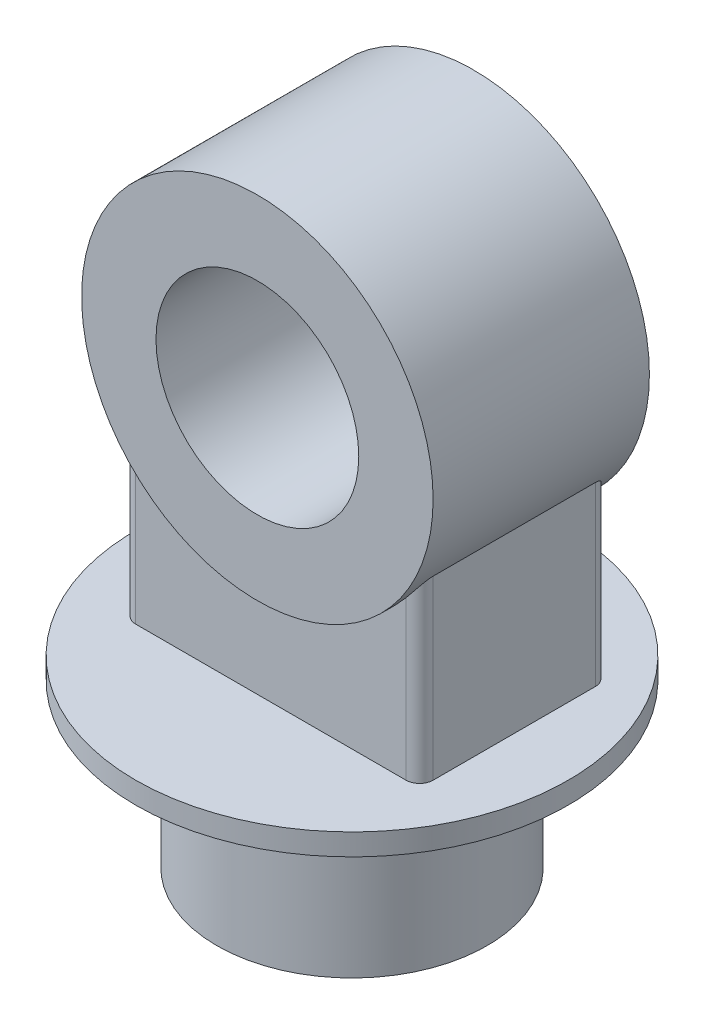
ISO-10303-21;
HEADER;
FILE_DESCRIPTION(('STEP AP214'),'2;1');
FILE_NAME('part.step','',(''),(''),'','','');
FILE_SCHEMA(('AUTOMOTIVE_DESIGN { 1 0 10303 214 1 1 1 1 }'));
ENDSEC;
DATA;
#1=APPLICATION_CONTEXT('core data for automotive mechanical design processes');
#2=APPLICATION_PROTOCOL_DEFINITION('international standard','automotive_design',2000,#1);
#3=PRODUCT_CONTEXT('',#1,'mechanical');
#4=PRODUCT('Part','Part','',(#3));
#5=PRODUCT_RELATED_PRODUCT_CATEGORY('part','',(#4));
#6=PRODUCT_DEFINITION_FORMATION('','',#4);
#7=PRODUCT_DEFINITION_CONTEXT('part definition',#1,'design');
#8=PRODUCT_DEFINITION('design','',#6,#7);
#9=PRODUCT_DEFINITION_SHAPE('','',#8);
#10=(LENGTH_UNIT() NAMED_UNIT(*) SI_UNIT(.MILLI.,.METRE.));
#11=(NAMED_UNIT(*) PLANE_ANGLE_UNIT() SI_UNIT($,.RADIAN.));
#12=(NAMED_UNIT(*) SI_UNIT($,.STERADIAN.) SOLID_ANGLE_UNIT());
#13=UNCERTAINTY_MEASURE_WITH_UNIT(LENGTH_MEASURE(1.E-05),#10,'distance_accuracy_value','');
#14=(GEOMETRIC_REPRESENTATION_CONTEXT(3) GLOBAL_UNCERTAINTY_ASSIGNED_CONTEXT((#13)) GLOBAL_UNIT_ASSIGNED_CONTEXT((#10,
#11,#12)) REPRESENTATION_CONTEXT('',''));
#15=CARTESIAN_POINT('',(0.,0.,0.));
#16=DIRECTION('',(0.,0.,1.));
#17=DIRECTION('',(1.,0.,0.));
#18=AXIS2_PLACEMENT_3D('',#15,#16,#17);
#19=CARTESIAN_POINT('',(0.,336.,90.));
#20=DIRECTION('',(0.,0.,-1.));
#21=DIRECTION('',(-1.,0.,0.));
#22=AXIS2_PLACEMENT_3D('',#19,#20,#21);
#23=CYLINDRICAL_SURFACE('',#22,130.);
#24=CARTESIAN_POINT('',(0.,336.,60.));
#25=DIRECTION('',(0.,0.,-1.));
#26=DIRECTION('',(-1.,0.,0.));
#27=AXIS2_PLACEMENT_3D('',#24,#25,#26);
#28=CIRCLE('',#27,130.);
#29=CARTESIAN_POINT('',(-100.,252.933761370819,60.));
#30=VERTEX_POINT('',#29);
#31=CARTESIAN_POINT('',(99.9999999999999,252.933761370819,60.));
#32=VERTEX_POINT('',#31);
#33=EDGE_CURVE('E107',#30,#32,#28,.F.);
#34=ORIENTED_EDGE('',*,*,#33,.T.);
#35=CARTESIAN_POINT('',(99.9999999999999,252.933761370819,60.));
#36=CARTESIAN_POINT('',(100.223611151915,253.202952503255,59.9999830665315));
#37=CARTESIAN_POINT('',(100.446118360057,253.473036166024,59.9924995885084));
#38=CARTESIAN_POINT('',(100.888548742496,254.014496760122,59.9629173131463));
#39=CARTESIAN_POINT('',(101.108472043759,254.285873626978,59.9408192370115));
#40=CARTESIAN_POINT('',(101.545586290072,254.829711400373,59.8822979337703));
#41=CARTESIAN_POINT('',(101.76277446753,255.102173087004,59.8458612385231));
#42=CARTESIAN_POINT('',(102.193849033468,255.647413797012,59.7588609087488));
#43=CARTESIAN_POINT('',(102.407735374993,255.920192824842,59.7082970735217));
#44=CARTESIAN_POINT('',(103.048408055095,256.74400885936,59.5343891784366));
#45=CARTESIAN_POINT('',(103.469748368072,257.294974230618,59.3894263280957));
#46=CARTESIAN_POINT('',(104.088382224678,258.11722484377,59.1288060997197));
#47=CARTESIAN_POINT('',(104.292337034927,258.39057162742,59.0347525474724));
#48=CARTESIAN_POINT('',(104.695498702643,258.935304765081,58.8319429710982));
#49=CARTESIAN_POINT('',(104.894706004332,259.206691300842,58.7231883289499));
#50=CARTESIAN_POINT('',(105.336170271764,259.812965668139,58.4620472638272));
#51=CARTESIAN_POINT('',(105.577006541077,260.147108038148,58.3055009036513));
#52=CARTESIAN_POINT('',(106.04966094987,260.809343252621,57.967808626391));
#53=CARTESIAN_POINT('',(106.281479043935,261.137436066616,57.7866625854444));
#54=CARTESIAN_POINT('',(106.734152264033,261.784259610706,57.3986376161628));
#55=CARTESIAN_POINT('',(106.955036134368,262.103013877598,57.1918317878757));
#56=CARTESIAN_POINT('',(107.384708325122,262.728803605627,56.749894392022));
#57=CARTESIAN_POINT('',(107.593501627276,263.035843875289,56.5147746155492));
#58=CARTESIAN_POINT('',(107.921279015409,263.522080966666,56.1068757916445));
#59=CARTESIAN_POINT('',(108.044709884718,263.706240813682,55.9435605188262));
#60=CARTESIAN_POINT('',(108.284949666933,264.066582834907,55.6038296157537));
#61=CARTESIAN_POINT('',(108.401760304956,264.242767084986,55.4274174262628));
#62=CARTESIAN_POINT('',(108.627683741988,264.585236991633,55.0605773993746));
#63=CARTESIAN_POINT('',(108.736797961361,264.751524473746,54.8701521613912));
#64=CARTESIAN_POINT('',(108.945874410432,265.071634412635,54.4745306992527));
#65=CARTESIAN_POINT('',(109.04583974995,265.225461102935,54.2693395369045));
#66=CARTESIAN_POINT('',(109.274660386151,265.579056080623,53.7536743100227));
#67=CARTESIAN_POINT('',(109.398046362816,265.771031349643,53.4351396850742));
#68=CARTESIAN_POINT('',(109.561336457207,266.026263049992,52.9345418523035));
#69=CARTESIAN_POINT('',(109.612072269395,266.105785634321,52.7641622498836));
#70=CARTESIAN_POINT('',(109.705421847597,266.25239837099,52.4160328323222));
#71=CARTESIAN_POINT('',(109.748040656091,266.319496241142,52.2382876769632));
#72=CARTESIAN_POINT('',(109.820262744001,266.433384610412,51.8947331689276));
#73=CARTESIAN_POINT('',(109.850752312767,266.481551609067,51.729567610939));
#74=CARTESIAN_POINT('',(109.903691363628,266.565274678987,51.3948451418076));
#75=CARTESIAN_POINT('',(109.926143541964,266.600834979285,51.2252897238033));
#76=CARTESIAN_POINT('',(109.962659042777,266.658707696818,50.8807814271977));
#77=CARTESIAN_POINT('',(109.976613864032,266.680848750137,50.7057875562757));
#78=CARTESIAN_POINT('',(109.99061964662,266.703076138542,50.4419386674803));
#79=CARTESIAN_POINT('',(109.99413386492,266.708654625171,50.3536902139711));
#80=CARTESIAN_POINT('',(109.998824989492,266.716102079045,50.1769662160102));
#81=CARTESIAN_POINT('',(110.000001659485,266.717970671296,50.088490649507));
#82=CARTESIAN_POINT('',(110.,266.717967697245,50.));
#83=B_SPLINE_CURVE_WITH_KNOTS('',3,(#35,#36,#37,#38,#39,#40,#41,#42,#43,#44,#45,#46,#47,#48,#49,
#50,#51,#52,#53,#54,#55,#56,#57,#58,#59,#60,#61,#62,#63,#64,#65,#66,#67,#68,#69,#70,#71,#72,#73,
#74,#75,#76,#77,#78,#79,#80,#81,#82),.UNSPECIFIED.,.F.,.F.,(4,2,2,2,2,2,2,2,2,2,2,2,2,2,2,2,2,2,
2,2,2,2,2,4),(0.,1.04974156507778,2.09943133114574,3.15010942417261,4.20080244462027,
6.32356278933856,7.3846521146533,8.44564176134496,9.76677685539392,11.0879186017609,
12.4053795382949,13.7222937149077,14.5479419827464,15.3733741023698,16.1986534888326,
17.023651302289,18.194686650492,18.7783719827905,19.3616935243415,19.8852298594992,
20.4085904030381,20.9385006934629,21.2038887699912,21.4693036704869),.UNSPECIFIED.);
#84=CARTESIAN_POINT('',(110.,266.717967697245,50.));
#85=VERTEX_POINT('',#84);
#86=EDGE_CURVE('E163',#32,#85,#83,.T.);
#87=ORIENTED_EDGE('',*,*,#86,.T.);
#88=DIRECTION('',(0.,0.,-1.));
#89=VECTOR('',#88,1.);
#90=CARTESIAN_POINT('',(110.,266.717967697245,90.));
#91=LINE('',#90,#89);
#92=CARTESIAN_POINT('',(110.,266.717967697245,-70.));
#93=VERTEX_POINT('',#92);
#94=EDGE_CURVE('E212',#85,#93,#91,.T.);
#95=ORIENTED_EDGE('',*,*,#94,.T.);
#96=CARTESIAN_POINT('',(110.,266.717967697245,-70.));
#97=CARTESIAN_POINT('',(110.000033683462,266.718025852698,-70.1614230595313));
#98=CARTESIAN_POINT('',(109.996092792414,266.711764254296,-70.3228118197691));
#99=CARTESIAN_POINT('',(109.980519982779,266.687045880384,-70.6441123999957));
#100=CARTESIAN_POINT('',(109.968896213713,266.668602027069,-70.8040256031146));
#101=CARTESIAN_POINT('',(109.938376398954,266.620217986395,-71.1196424551221));
#102=CARTESIAN_POINT('',(109.919558261622,266.590400967593,-71.2753727040436));
#103=CARTESIAN_POINT('',(109.875071558334,266.52000006118,-71.5834085562727));
#104=CARTESIAN_POINT('',(109.849400846184,266.479412800404,-71.7357130704249));
#105=CARTESIAN_POINT('',(109.784772267017,266.377386983169,-72.0722520040974));
#106=CARTESIAN_POINT('',(109.744103525393,266.313281105855,-72.2553511890568));
#107=CARTESIAN_POINT('',(109.654040532803,266.171650231929,-72.6141464391851));
#108=CARTESIAN_POINT('',(109.604640075501,266.094115691273,-72.7898371277865));
#109=CARTESIAN_POINT('',(109.497968805892,265.927147418338,-73.133872391345));
#110=CARTESIAN_POINT('',(109.440667457039,265.837667562915,-73.302184951541));
#111=CARTESIAN_POINT('',(109.319341126161,265.648779195145,-73.6304969218558));
#112=CARTESIAN_POINT('',(109.25531768694,265.549372961282,-73.7904982269664));
#113=CARTESIAN_POINT('',(109.085069343255,265.285901292919,-74.1868876463209));
#114=CARTESIAN_POINT('',(108.974781990569,265.115997241409,-74.4176642111939));
#115=CARTESIAN_POINT('',(108.742772943656,264.76058359918,-74.8607110351426));
#116=CARTESIAN_POINT('',(108.621044869784,264.575065307649,-75.072970840064));
#117=CARTESIAN_POINT('',(108.36794946479,264.19164129378,-75.4804206329535));
#118=CARTESIAN_POINT('',(108.236568322626,263.993717884812,-75.6755852518652));
#119=CARTESIAN_POINT('',(107.965814499919,263.588382733387,-76.0497203250662));
#120=CARTESIAN_POINT('',(107.826442440892,263.380971729107,-76.2286920360201));
#121=CARTESIAN_POINT('',(107.56145650763,262.989174407744,-76.5468161797372));
#122=CARTESIAN_POINT('',(107.436764821801,262.805791987749,-76.6879854690674));
#123=CARTESIAN_POINT('',(107.182869679799,262.434497987953,-76.9599552926783));
#124=CARTESIAN_POINT('',(107.053665586411,262.24658576965,-77.0907543539386));
#125=CARTESIAN_POINT('',(106.659844344167,261.677121003612,-77.4685356621902));
#126=CARTESIAN_POINT('',(106.389102445143,261.289965080353,-77.7008024816961));
#127=CARTESIAN_POINT('',(105.833418194946,260.504836154638,-78.129863631631));
#128=CARTESIAN_POINT('',(105.548442441802,260.106838810795,-78.3265689888296));
#129=CARTESIAN_POINT('',(104.96676628824,259.304344779382,-78.6860846955172));
#130=CARTESIAN_POINT('',(104.670068038633,258.899849292081,-78.8489012287858));
#131=CARTESIAN_POINT('',(104.024574509401,258.030646711215,-79.1623550419402));
#132=CARTESIAN_POINT('',(103.674248758637,257.565348460988,-79.3081944572228));
#133=CARTESIAN_POINT('',(102.961876677953,256.632523338709,-79.558756520093));
#134=CARTESIAN_POINT('',(102.599828734006,256.16499616738,-79.6634734792563));
#135=CARTESIAN_POINT('',(102.051092736822,255.466397204689,-79.7891645729388));
#136=CARTESIAN_POINT('',(101.868137468165,255.235094848973,-79.8257282191264));
#137=CARTESIAN_POINT('',(101.499966150616,254.77288550036,-79.8886289353229));
#138=CARTESIAN_POINT('',(101.314750133026,254.541978502041,-79.9149661467555));
#139=CARTESIAN_POINT('',(100.942320486513,254.080919722901,-79.9572665465168));
#140=CARTESIAN_POINT('',(100.755107350153,253.850767773367,-79.9732322353467));
#141=CARTESIAN_POINT('',(100.378860262163,253.391449185777,-79.9945948234744));
#142=CARTESIAN_POINT('',(100.189826234412,253.162282589497,-79.9999912789888));
#143=CARTESIAN_POINT('',(99.9999999999999,252.933761370819,-80.));
#144=B_SPLINE_CURVE_WITH_KNOTS('',3,(#96,#97,#98,#99,#100,#101,#102,#103,#104,#105,#106,#107,
#108,#109,#110,#111,#112,#113,#114,#115,#116,#117,#118,#119,#120,#121,#122,#123,#124,#125,#126,
#127,#128,#129,#130,#131,#132,#133,#134,#135,#136,#137,#138,#139,#140,#141,#142,#143),
.UNSPECIFIED.,.F.,.F.,(4,2,2,2,2,2,2,2,2,2,2,2,2,2,2,2,2,2,2,2,2,2,2,4),(0.,0.484045005923069,
0.967577389145399,1.44601544684509,1.92460352520314,2.51835043890469,3.11252108624076,
3.7090561398874,4.30545457926274,5.22516595363372,6.1453932609233,7.06696382284197,
7.98846280401967,8.77680092000542,9.56525081419906,11.1426900482287,12.7240229357798,
14.305067020047,16.1047501551828,17.9046821508918,18.7960435003637,19.6873925225409,
20.5785265668947,21.4696980275819),.UNSPECIFIED.);
#145=CARTESIAN_POINT('',(99.9999999999999,252.933761370819,-80.));
#146=VERTEX_POINT('',#145);
#147=EDGE_CURVE('E11',#93,#146,#144,.T.);
#148=ORIENTED_EDGE('',*,*,#147,.T.);
#149=CARTESIAN_POINT('',(0.,336.,-80.));
#150=DIRECTION('',(0.,0.,1.));
#151=DIRECTION('',(1.,0.,0.));
#152=AXIS2_PLACEMENT_3D('',#149,#150,#151);
#153=CIRCLE('',#152,130.);
#154=CARTESIAN_POINT('',(-100.,252.933761370819,-80.));
#155=VERTEX_POINT('',#154);
#156=EDGE_CURVE('E188',#146,#155,#153,.F.);
#157=ORIENTED_EDGE('',*,*,#156,.T.);
#158=CARTESIAN_POINT('',(-100.,252.933761370819,-80.));
#159=CARTESIAN_POINT('',(-100.223611151915,253.202952503255,-79.9999830665315));
#160=CARTESIAN_POINT('',(-100.446118360057,253.473036166024,-79.9924995885085));
#161=CARTESIAN_POINT('',(-100.888548742496,254.014496760122,-79.9629173131463));
#162=CARTESIAN_POINT('',(-101.10847204376,254.285873626978,-79.9408192370116));
#163=CARTESIAN_POINT('',(-101.545586290072,254.829711400373,-79.8822979337703));
#164=CARTESIAN_POINT('',(-101.76277446753,255.102173087004,-79.8458612385231));
#165=CARTESIAN_POINT('',(-102.193849033468,255.647413797012,-79.7588609087488));
#166=CARTESIAN_POINT('',(-102.407735374993,255.920192824843,-79.7082970735217));
#167=CARTESIAN_POINT('',(-103.048408055095,256.74400885936,-79.5343891784366));
#168=CARTESIAN_POINT('',(-103.469748368072,257.294974230618,-79.3894263280957));
#169=CARTESIAN_POINT('',(-104.088382224678,258.117224843771,-79.1288060997197));
#170=CARTESIAN_POINT('',(-104.292337034927,258.390571627421,-79.0347525474724));
#171=CARTESIAN_POINT('',(-104.695498702643,258.935304765081,-78.8319429710981));
#172=CARTESIAN_POINT('',(-104.894706004332,259.206691300843,-78.7231883289499));
#173=CARTESIAN_POINT('',(-105.336170271764,259.812965668139,-78.4620472638272));
#174=CARTESIAN_POINT('',(-105.577006541077,260.147108038148,-78.3055009036513));
#175=CARTESIAN_POINT('',(-106.049660949871,260.809343252621,-77.967808626391));
#176=CARTESIAN_POINT('',(-106.281479043935,261.137436066616,-77.7866625854443));
#177=CARTESIAN_POINT('',(-106.734152264033,261.784259610706,-77.3986376161628));
#178=CARTESIAN_POINT('',(-106.955036134368,262.103013877599,-77.1918317878757));
#179=CARTESIAN_POINT('',(-107.384708325122,262.728803605627,-76.749894392022));
#180=CARTESIAN_POINT('',(-107.593501627276,263.035843875289,-76.5147746155492));
#181=CARTESIAN_POINT('',(-107.921279015409,263.522080966667,-76.1068757916446));
#182=CARTESIAN_POINT('',(-108.044709884718,263.706240813683,-75.9435605188263));
#183=CARTESIAN_POINT('',(-108.284949666933,264.066582834907,-75.6038296157538));
#184=CARTESIAN_POINT('',(-108.401760304956,264.242767084987,-75.4274174262628));
#185=CARTESIAN_POINT('',(-108.627683741988,264.585236991633,-75.0605773993746));
#186=CARTESIAN_POINT('',(-108.736797961361,264.751524473746,-74.8701521613913));
#187=CARTESIAN_POINT('',(-108.945874410432,265.071634412635,-74.4745306992528));
#188=CARTESIAN_POINT('',(-109.04583974995,265.225461102935,-74.2693395369045));
#189=CARTESIAN_POINT('',(-109.274660386151,265.579056080623,-73.7536743100228));
#190=CARTESIAN_POINT('',(-109.398046362816,265.771031349643,-73.4351396850743));
#191=CARTESIAN_POINT('',(-109.561336457207,266.026263049993,-72.9345418523036));
#192=CARTESIAN_POINT('',(-109.612072269395,266.105785634321,-72.7641622498837));
#193=CARTESIAN_POINT('',(-109.705421847597,266.25239837099,-72.4160328323223));
#194=CARTESIAN_POINT('',(-109.748040656091,266.319496241142,-72.2382876769633));
#195=CARTESIAN_POINT('',(-109.820262744001,266.433384610412,-71.8947331689276));
#196=CARTESIAN_POINT('',(-109.850752312767,266.481551609067,-71.729567610939));
#197=CARTESIAN_POINT('',(-109.903691363628,266.565274678988,-71.3948451418076));
#198=CARTESIAN_POINT('',(-109.926143541964,266.600834979285,-71.2252897238033));
#199=CARTESIAN_POINT('',(-109.962659042777,266.658707696818,-70.8807814271977));
#200=CARTESIAN_POINT('',(-109.976613864033,266.680848750137,-70.7057875562757));
#201=CARTESIAN_POINT('',(-109.99061964662,266.703076138543,-70.4419386674803));
#202=CARTESIAN_POINT('',(-109.99413386492,266.708654625172,-70.3536902139711));
#203=CARTESIAN_POINT('',(-109.998824989492,266.716102079046,-70.1769662160102));
#204=CARTESIAN_POINT('',(-110.000001659485,266.717970671296,-70.088490649507));
#205=CARTESIAN_POINT('',(-110.,266.717967697245,-70.));
#206=B_SPLINE_CURVE_WITH_KNOTS('',3,(#158,#159,#160,#161,#162,#163,#164,#165,#166,#167,#168,
#169,#170,#171,#172,#173,#174,#175,#176,#177,#178,#179,#180,#181,#182,#183,#184,#185,#186,#187,
#188,#189,#190,#191,#192,#193,#194,#195,#196,#197,#198,#199,#200,#201,#202,#203,#204,#205),
.UNSPECIFIED.,.F.,.F.,(4,2,2,2,2,2,2,2,2,2,2,2,2,2,2,2,2,2,2,2,2,2,2,4),(0.,1.04974156507783,
2.09943133114573,3.15010942417265,4.20080244462036,6.32356278933867,7.38465211465335,
8.44564176134507,9.76677685539403,11.087918601761,12.4053795382949,13.7222937149077,
14.5479419827464,15.3733741023698,16.1986534888326,17.0236513022889,18.1946866504919,
18.7783719827904,19.3616935243415,19.8852298594992,20.4085904030381,20.9385006934629,
21.2038887699912,21.4693036704869),.UNSPECIFIED.);
#207=CARTESIAN_POINT('',(-110.,266.717967697245,-70.));
#208=VERTEX_POINT('',#207);
#209=EDGE_CURVE('E180',#155,#208,#206,.T.);
#210=ORIENTED_EDGE('',*,*,#209,.T.);
#211=DIRECTION('',(0.,0.,-1.));
#212=VECTOR('',#211,1.);
#213=CARTESIAN_POINT('',(-110.,266.717967697245,90.));
#214=LINE('',#213,#212);
#215=CARTESIAN_POINT('',(-110.,266.717967697245,50.));
#216=VERTEX_POINT('',#215);
#217=EDGE_CURVE('E110',#208,#216,#214,.F.);
#218=ORIENTED_EDGE('',*,*,#217,.T.);
#219=CARTESIAN_POINT('',(-110.,266.717967697245,50.));
#220=CARTESIAN_POINT('',(-110.000033683462,266.718025852698,50.1614230595313));
#221=CARTESIAN_POINT('',(-109.996092792414,266.711764254296,50.3228118197691));
#222=CARTESIAN_POINT('',(-109.980519982779,266.687045880384,50.6441123999957));
#223=CARTESIAN_POINT('',(-109.968896213713,266.668602027069,50.8040256031146));
#224=CARTESIAN_POINT('',(-109.938376398954,266.620217986395,51.1196424551221));
#225=CARTESIAN_POINT('',(-109.919558261622,266.590400967593,51.2753727040436));
#226=CARTESIAN_POINT('',(-109.875071558334,266.52000006118,51.5834085562726));
#227=CARTESIAN_POINT('',(-109.849400846184,266.479412800404,51.7357130704249));
#228=CARTESIAN_POINT('',(-109.784772267018,266.377386983169,52.0722520040974));
#229=CARTESIAN_POINT('',(-109.744103525393,266.313281105856,52.2553511890568));
#230=CARTESIAN_POINT('',(-109.654040532803,266.17165023193,52.6141464391851));
#231=CARTESIAN_POINT('',(-109.604640075501,266.094115691273,52.7898371277865));
#232=CARTESIAN_POINT('',(-109.497968805892,265.927147418338,53.133872391345));
#233=CARTESIAN_POINT('',(-109.440667457039,265.837667562915,53.302184951541));
#234=CARTESIAN_POINT('',(-109.319341126161,265.648779195145,53.6304969218558));
#235=CARTESIAN_POINT('',(-109.25531768694,265.549372961282,53.7904982269664));
#236=CARTESIAN_POINT('',(-109.085069343255,265.28590129292,54.1868876463209));
#237=CARTESIAN_POINT('',(-108.974781990569,265.115997241409,54.4176642111939));
#238=CARTESIAN_POINT('',(-108.742772943656,264.76058359918,54.8607110351426));
#239=CARTESIAN_POINT('',(-108.621044869784,264.575065307649,55.072970840064));
#240=CARTESIAN_POINT('',(-108.36794946479,264.19164129378,55.4804206329535));
#241=CARTESIAN_POINT('',(-108.236568322626,263.993717884812,55.6755852518652));
#242=CARTESIAN_POINT('',(-107.965814499919,263.588382733388,56.0497203250662));
#243=CARTESIAN_POINT('',(-107.826442440892,263.380971729107,56.2286920360201));
#244=CARTESIAN_POINT('',(-107.56145650763,262.989174407744,56.5468161797372));
#245=CARTESIAN_POINT('',(-107.436764821801,262.805791987749,56.6879854690673));
#246=CARTESIAN_POINT('',(-107.1828696798,262.434497987953,56.9599552926783));
#247=CARTESIAN_POINT('',(-107.053665586412,262.24658576965,57.0907543539386));
#248=CARTESIAN_POINT('',(-106.659844344167,261.677121003612,57.4685356621902));
#249=CARTESIAN_POINT('',(-106.389102445143,261.289965080353,57.7008024816961));
#250=CARTESIAN_POINT('',(-105.833418194947,260.504836154638,58.129863631631));
#251=CARTESIAN_POINT('',(-105.548442441802,260.106838810795,58.3265689888296));
#252=CARTESIAN_POINT('',(-104.96676628824,259.304344779382,58.6860846955171));
#253=CARTESIAN_POINT('',(-104.670068038633,258.899849292081,58.8489012287858));
#254=CARTESIAN_POINT('',(-104.024574509401,258.030646711215,59.1623550419402));
#255=CARTESIAN_POINT('',(-103.674248758637,257.565348460988,59.3081944572228));
#256=CARTESIAN_POINT('',(-102.961876677953,256.632523338709,59.558756520093));
#257=CARTESIAN_POINT('',(-102.599828734006,256.16499616738,59.6634734792563));
#258=CARTESIAN_POINT('',(-102.051092736822,255.46639720469,59.7891645729387));
#259=CARTESIAN_POINT('',(-101.868137468165,255.235094848973,59.8257282191264));
#260=CARTESIAN_POINT('',(-101.499966150616,254.772885500361,59.8886289353229));
#261=CARTESIAN_POINT('',(-101.314750133026,254.541978502041,59.9149661467555));
#262=CARTESIAN_POINT('',(-100.942320486513,254.080919722901,59.9572665465167));
#263=CARTESIAN_POINT('',(-100.755107350153,253.850767773368,59.9732322353467));
#264=CARTESIAN_POINT('',(-100.378860262163,253.391449185777,59.9945948234744));
#265=CARTESIAN_POINT('',(-100.189826234412,253.162282589497,59.9999912789888));
#266=CARTESIAN_POINT('',(-100.,252.933761370819,60.));
#267=B_SPLINE_CURVE_WITH_KNOTS('',3,(#219,#220,#221,#222,#223,#224,#225,#226,#227,#228,#229,
#230,#231,#232,#233,#234,#235,#236,#237,#238,#239,#240,#241,#242,#243,#244,#245,#246,#247,#248,
#249,#250,#251,#252,#253,#254,#255,#256,#257,#258,#259,#260,#261,#262,#263,#264,#265,#266),
.UNSPECIFIED.,.F.,.F.,(4,2,2,2,2,2,2,2,2,2,2,2,2,2,2,2,2,2,2,2,2,2,2,4),(0.,0.484045005923079,
0.967577389145415,1.44601544684507,1.92460352520313,2.51835043890467,3.11252108624077,
3.70905613988742,4.30545457926273,5.22516595363371,6.14539326092326,7.06696382284192,
7.98846280401964,8.77680092000539,9.56525081419895,11.1426900482287,12.7240229357798,
14.3050670200471,16.1047501551829,17.9046821508918,18.7960435003637,19.6873925225409,
20.5785265668948,21.4696980275819),.UNSPECIFIED.);
#268=EDGE_CURVE('E104',#216,#30,#267,.T.);
#269=ORIENTED_EDGE('',*,*,#268,.T.);
#270=EDGE_LOOP('',(#34,#87,#95,#148,#157,#210,#218,#269));
#271=FACE_BOUND('',#270,.T.);
#272=CARTESIAN_POINT('',(0.,336.,-90.));
#273=DIRECTION('',(0.,0.,1.));
#274=DIRECTION('',(1.,0.,0.));
#275=AXIS2_PLACEMENT_3D('',#272,#273,#274);
#276=CIRCLE('',#275,130.);
#277=CARTESIAN_POINT('',(130.,336.,-90.));
#278=VERTEX_POINT('',#277);
#279=EDGE_CURVE('E126',#278,#278,#276,.T.);
#280=ORIENTED_EDGE('',*,*,#279,.T.);
#281=EDGE_LOOP('',(#280));
#282=FACE_BOUND('',#281,.T.);
#283=CARTESIAN_POINT('',(0.,336.,70.));
#284=DIRECTION('',(0.,0.,1.));
#285=DIRECTION('',(1.,0.,0.));
#286=AXIS2_PLACEMENT_3D('',#283,#284,#285);
#287=CIRCLE('',#286,130.);
#288=CARTESIAN_POINT('',(130.,336.,70.));
#289=VERTEX_POINT('',#288);
#290=EDGE_CURVE('E226',#289,#289,#287,.T.);
#291=ORIENTED_EDGE('',*,*,#290,.F.);
#292=EDGE_LOOP('',(#291));
#293=FACE_BOUND('',#292,.T.);
#294=ADVANCED_FACE('F33',(#271,#282,#293),#23,.T.);
#295=CARTESIAN_POINT('',(0.,336.,90.));
#296=DIRECTION('',(0.,0.,-1.));
#297=DIRECTION('',(-1.,0.,0.));
#298=AXIS2_PLACEMENT_3D('',#295,#296,#297);
#299=CYLINDRICAL_SURFACE('',#298,75.);
#300=CARTESIAN_POINT('',(0.,336.,-90.));
#301=DIRECTION('',(0.,0.,1.));
#302=DIRECTION('',(1.,0.,0.));
#303=AXIS2_PLACEMENT_3D('',#300,#301,#302);
#304=CIRCLE('',#303,75.);
#305=CARTESIAN_POINT('',(-75.,336.,-90.));
#306=VERTEX_POINT('',#305);
#307=EDGE_CURVE('E230',#306,#306,#304,.T.);
#308=CARTESIAN_POINT('',(0.,336.,70.));
#309=DIRECTION('',(0.,0.,1.));
#310=DIRECTION('',(1.,0.,0.));
#311=AXIS2_PLACEMENT_3D('',#308,#309,#310);
#312=CIRCLE('',#311,75.);
#313=CARTESIAN_POINT('',(-75.,336.,70.));
#314=VERTEX_POINT('',#313);
#315=EDGE_CURVE('E224',#314,#314,#312,.T.);
#316=CARTESIAN_POINT('',(-75.,336.,-90.));
#317=CARTESIAN_POINT('',(-75.,336.,-88.3333333333334));
#318=CARTESIAN_POINT('',(-75.,336.,-86.6666666666667));
#319=CARTESIAN_POINT('',(-75.,336.,-83.3333333333334));
#320=CARTESIAN_POINT('',(-75.,336.,-81.6666666666667));
#321=CARTESIAN_POINT('',(-75.,336.,-78.3333333333334));
#322=CARTESIAN_POINT('',(-75.,336.,-76.6666666666667));
#323=CARTESIAN_POINT('',(-75.,336.,-73.3333333333333));
#324=CARTESIAN_POINT('',(-75.,336.,-71.6666666666667));
#325=CARTESIAN_POINT('',(-75.,336.,-68.3333333333333));
#326=CARTESIAN_POINT('',(-75.,336.,-66.6666666666667));
#327=CARTESIAN_POINT('',(-75.,336.,-63.3333333333334));
#328=CARTESIAN_POINT('',(-75.,336.,-61.6666666666667));
#329=CARTESIAN_POINT('',(-75.,336.,-58.3333333333334));
#330=CARTESIAN_POINT('',(-75.,336.,-56.6666666666667));
#331=CARTESIAN_POINT('',(-75.,336.,-53.3333333333333));
#332=CARTESIAN_POINT('',(-75.,336.,-51.6666666666667));
#333=CARTESIAN_POINT('',(-75.,336.,-48.3333333333333));
#334=CARTESIAN_POINT('',(-75.,336.,-46.6666666666667));
#335=CARTESIAN_POINT('',(-75.,336.,-43.3333333333333));
#336=CARTESIAN_POINT('',(-75.,336.,-41.6666666666667));
#337=CARTESIAN_POINT('',(-75.,336.,-38.3333333333333));
#338=CARTESIAN_POINT('',(-75.,336.,-36.6666666666667));
#339=CARTESIAN_POINT('',(-75.,336.,-33.3333333333334));
#340=CARTESIAN_POINT('',(-75.,336.,-31.6666666666667));
#341=CARTESIAN_POINT('',(-75.,336.,-28.3333333333334));
#342=CARTESIAN_POINT('',(-75.,336.,-26.6666666666667));
#343=CARTESIAN_POINT('',(-75.,336.,-23.3333333333334));
#344=CARTESIAN_POINT('',(-75.,336.,-21.6666666666667));
#345=CARTESIAN_POINT('',(-75.,336.,-18.3333333333334));
#346=CARTESIAN_POINT('',(-75.,336.,-16.6666666666667));
#347=CARTESIAN_POINT('',(-75.,336.,-13.3333333333334));
#348=CARTESIAN_POINT('',(-75.,336.,-11.6666666666667));
#349=CARTESIAN_POINT('',(-75.,336.,-8.33333333333335));
#350=CARTESIAN_POINT('',(-75.,336.,-6.66666666666669));
#351=CARTESIAN_POINT('',(-75.,336.,-3.33333333333335));
#352=CARTESIAN_POINT('',(-75.,336.,-1.66666666666668));
#353=CARTESIAN_POINT('',(-75.,336.,1.66666666666665));
#354=CARTESIAN_POINT('',(-75.,336.,3.33333333333331));
#355=CARTESIAN_POINT('',(-75.,336.,6.66666666666664));
#356=CARTESIAN_POINT('',(-75.,336.,8.33333333333331));
#357=CARTESIAN_POINT('',(-75.,336.,11.6666666666666));
#358=CARTESIAN_POINT('',(-75.,336.,13.3333333333333));
#359=CARTESIAN_POINT('',(-75.,336.,16.6666666666667));
#360=CARTESIAN_POINT('',(-75.,336.,18.3333333333333));
#361=CARTESIAN_POINT('',(-75.,336.,21.6666666666666));
#362=CARTESIAN_POINT('',(-75.,336.,23.3333333333333));
#363=CARTESIAN_POINT('',(-75.,336.,26.6666666666666));
#364=CARTESIAN_POINT('',(-75.,336.,28.3333333333333));
#365=CARTESIAN_POINT('',(-75.,336.,31.6666666666667));
#366=CARTESIAN_POINT('',(-75.,336.,33.3333333333333));
#367=CARTESIAN_POINT('',(-75.,336.,36.6666666666667));
#368=CARTESIAN_POINT('',(-75.,336.,38.3333333333333));
#369=CARTESIAN_POINT('',(-75.,336.,41.6666666666667));
#370=CARTESIAN_POINT('',(-75.,336.,43.3333333333333));
#371=CARTESIAN_POINT('',(-75.,336.,46.6666666666667));
#372=CARTESIAN_POINT('',(-75.,336.,48.3333333333333));
#373=CARTESIAN_POINT('',(-75.,336.,51.6666666666666));
#374=CARTESIAN_POINT('',(-75.,336.,53.3333333333333));
#375=CARTESIAN_POINT('',(-75.,336.,56.6666666666666));
#376=CARTESIAN_POINT('',(-75.,336.,58.3333333333333));
#377=CARTESIAN_POINT('',(-75.,336.,61.6666666666666));
#378=CARTESIAN_POINT('',(-75.,336.,63.3333333333333));
#379=CARTESIAN_POINT('',(-75.,336.,66.6666666666666));
#380=CARTESIAN_POINT('',(-75.,336.,68.3333333333333));
#381=CARTESIAN_POINT('',(-75.,336.,70.));
#382=B_SPLINE_CURVE_WITH_KNOTS('',3,(#316,#317,#318,#319,#320,#321,#322,#323,#324,#325,#326,
#327,#328,#329,#330,#331,#332,#333,#334,#335,#336,#337,#338,#339,#340,#341,#342,#343,#344,#345,
#346,#347,#348,#349,#350,#351,#352,#353,#354,#355,#356,#357,#358,#359,#360,#361,#362,#363,#364,
#365,#366,#367,#368,#369,#370,#371,#372,#373,#374,#375,#376,#377,#378,#379,#380,#381),
.UNSPECIFIED.,.F.,.F.,(4,2,2,2,2,2,2,2,2,2,2,2,2,2,2,2,2,2,2,2,2,2,2,2,2,2,2,2,2,2,2,2,4),(0.,
5.,10.,15.,20.,25.,30.,35.,40.,45.,50.,55.,60.,65.,70.,75.,80.,85.,90.,95.,100.,105.,110.,115.,
120.,125.,130.,135.,140.,145.,150.,155.,160.),.UNSPECIFIED.);
#383=EDGE_CURVE('BSEAM247',#306,#314,#382,.T.);
#384=ORIENTED_EDGE('',*,*,#307,.F.);
#385=ORIENTED_EDGE('',*,*,#315,.T.);
#386=ORIENTED_EDGE('',*,*,#383,.T.);
#387=ORIENTED_EDGE('',*,*,#383,.F.);
#388=EDGE_LOOP('',(#384,#386,#385,#387));
#389=FACE_BOUND('',#388,.T.);
#390=ADVANCED_FACE('F247',(#389),#299,.F.);
#391=CARTESIAN_POINT('',(0.,120.,0.));
#392=DIRECTION('',(0.,-1.,0.));
#393=DIRECTION('',(0.,0.,-1.));
#394=AXIS2_PLACEMENT_3D('',#391,#392,#393);
#395=CYLINDRICAL_SURFACE('',#394,100.);
#396=CARTESIAN_POINT('',(0.,120.,0.));
#397=DIRECTION('',(0.,1.,0.));
#398=DIRECTION('',(0.,0.,1.));
#399=AXIS2_PLACEMENT_3D('',#396,#397,#398);
#400=CIRCLE('',#399,100.);
#401=CARTESIAN_POINT('',(0.,120.,100.));
#402=VERTEX_POINT('',#401);
#403=EDGE_CURVE('E134',#402,#402,#400,.T.);
#404=ORIENTED_EDGE('',*,*,#403,.F.);
#405=EDGE_LOOP('',(#404));
#406=FACE_BOUND('',#405,.T.);
#407=CARTESIAN_POINT('',(0.,0.,0.));
#408=DIRECTION('',(0.,1.,0.));
#409=DIRECTION('',(0.,0.,1.));
#410=AXIS2_PLACEMENT_3D('',#407,#408,#409);
#411=CIRCLE('',#410,100.);
#412=CARTESIAN_POINT('',(0.,0.,100.));
#413=VERTEX_POINT('',#412);
#414=EDGE_CURVE('E218',#413,#413,#411,.T.);
#415=ORIENTED_EDGE('',*,*,#414,.T.);
#416=EDGE_LOOP('',(#415));
#417=FACE_BOUND('',#416,.T.);
#418=ADVANCED_FACE('F156',(#406,#417),#395,.T.);
#419=CARTESIAN_POINT('',(0.,0.,0.));
#420=DIRECTION('',(0.,1.,0.));
#421=DIRECTION('',(0.,0.,1.));
#422=AXIS2_PLACEMENT_3D('',#419,#420,#421);
#423=PLANE('',#422);
#424=ORIENTED_EDGE('',*,*,#414,.F.);
#425=EDGE_LOOP('',(#424));
#426=FACE_BOUND('',#425,.T.);
#427=ADVANCED_FACE('F256',(#426),#423,.F.);
#428=CARTESIAN_POINT('',(0.,136.,0.));
#429=DIRECTION('',(0.,-1.,0.));
#430=DIRECTION('',(0.,0.,-1.));
#431=AXIS2_PLACEMENT_3D('',#428,#429,#430);
#432=CYLINDRICAL_SURFACE('',#431,160.);
#433=CARTESIAN_POINT('',(0.,136.,0.));
#434=DIRECTION('',(0.,1.,0.));
#435=DIRECTION('',(0.,0.,1.));
#436=AXIS2_PLACEMENT_3D('',#433,#434,#435);
#437=CIRCLE('',#436,160.);
#438=CARTESIAN_POINT('',(0.,136.,160.));
#439=VERTEX_POINT('',#438);
#440=EDGE_CURVE('E215',#439,#439,#437,.T.);
#441=ORIENTED_EDGE('',*,*,#440,.F.);
#442=EDGE_LOOP('',(#441));
#443=FACE_BOUND('',#442,.T.);
#444=CARTESIAN_POINT('',(0.,120.,0.));
#445=DIRECTION('',(0.,1.,0.));
#446=DIRECTION('',(0.,0.,1.));
#447=AXIS2_PLACEMENT_3D('',#444,#445,#446);
#448=CIRCLE('',#447,160.);
#449=CARTESIAN_POINT('',(0.,120.,160.));
#450=VERTEX_POINT('',#449);
#451=EDGE_CURVE('E206',#450,#450,#448,.T.);
#452=ORIENTED_EDGE('',*,*,#451,.T.);
#453=EDGE_LOOP('',(#452));
#454=FACE_BOUND('',#453,.T.);
#455=ADVANCED_FACE('F281',(#443,#454),#432,.T.);
#456=CARTESIAN_POINT('',(0.,136.,0.));
#457=DIRECTION('',(0.,1.,0.));
#458=DIRECTION('',(0.,0.,1.));
#459=AXIS2_PLACEMENT_3D('',#456,#457,#458);
#460=PLANE('',#459);
#461=DIRECTION('',(0.,0.,-1.));
#462=VECTOR('',#461,1.);
#463=CARTESIAN_POINT('',(110.,136.,60.));
#464=LINE('',#463,#462);
#465=CARTESIAN_POINT('',(110.,136.,50.));
#466=VERTEX_POINT('',#465);
#467=CARTESIAN_POINT('',(110.,136.,-70.));
#468=VERTEX_POINT('',#467);
#469=EDGE_CURVE('E204',#466,#468,#464,.T.);
#470=ORIENTED_EDGE('',*,*,#469,.F.);
#471=CARTESIAN_POINT('',(99.9999999999999,136.,50.));
#472=DIRECTION('',(0.,1.,0.));
#473=DIRECTION('',(0.,0.,1.));
#474=AXIS2_PLACEMENT_3D('',#471,#472,#473);
#475=CIRCLE('',#474,10.);
#476=CARTESIAN_POINT('',(99.9999999999999,136.,60.));
#477=VERTEX_POINT('',#476);
#478=EDGE_CURVE('E115',#466,#477,#475,.F.);
#479=ORIENTED_EDGE('',*,*,#478,.T.);
#480=DIRECTION('',(1.,0.,0.));
#481=VECTOR('',#480,1.);
#482=CARTESIAN_POINT('',(107.277662826113,136.,60.));
#483=LINE('',#482,#481);
#484=CARTESIAN_POINT('',(-100.,136.,60.));
#485=VERTEX_POINT('',#484);
#486=EDGE_CURVE('E208',#485,#477,#483,.T.);
#487=ORIENTED_EDGE('',*,*,#486,.F.);
#488=CARTESIAN_POINT('',(-100.,136.,50.));
#489=DIRECTION('',(0.,1.,0.));
#490=DIRECTION('',(0.,0.,1.));
#491=AXIS2_PLACEMENT_3D('',#488,#489,#490);
#492=CIRCLE('',#491,10.);
#493=CARTESIAN_POINT('',(-110.,136.,50.));
#494=VERTEX_POINT('',#493);
#495=EDGE_CURVE('E116',#485,#494,#492,.F.);
#496=ORIENTED_EDGE('',*,*,#495,.T.);
#497=DIRECTION('',(0.,0.,1.));
#498=VECTOR('',#497,1.);
#499=CARTESIAN_POINT('',(-110.,136.,60.));
#500=LINE('',#499,#498);
#501=CARTESIAN_POINT('',(-110.,136.,-70.));
#502=VERTEX_POINT('',#501);
#503=EDGE_CURVE('E200',#502,#494,#500,.T.);
#504=ORIENTED_EDGE('',*,*,#503,.F.);
#505=CARTESIAN_POINT('',(-100.,136.,-70.));
#506=DIRECTION('',(0.,1.,0.));
#507=DIRECTION('',(0.,0.,1.));
#508=AXIS2_PLACEMENT_3D('',#505,#506,#507);
#509=CIRCLE('',#508,10.);
#510=CARTESIAN_POINT('',(-100.,136.,-80.));
#511=VERTEX_POINT('',#510);
#512=EDGE_CURVE('E178',#502,#511,#509,.F.);
#513=ORIENTED_EDGE('',*,*,#512,.T.);
#514=DIRECTION('',(-1.,0.,0.));
#515=VECTOR('',#514,1.);
#516=CARTESIAN_POINT('',(-110.,136.,-80.));
#517=LINE('',#516,#515);
#518=CARTESIAN_POINT('',(99.9999999999999,136.,-80.));
#519=VERTEX_POINT('',#518);
#520=EDGE_CURVE('E199',#519,#511,#517,.T.);
#521=ORIENTED_EDGE('',*,*,#520,.F.);
#522=CARTESIAN_POINT('',(99.9999999999999,136.,-70.));
#523=DIRECTION('',(0.,1.,0.));
#524=DIRECTION('',(0.,0.,1.));
#525=AXIS2_PLACEMENT_3D('',#522,#523,#524);
#526=CIRCLE('',#525,10.);
#527=EDGE_CURVE('E47',#519,#468,#526,.F.);
#528=ORIENTED_EDGE('',*,*,#527,.T.);
#529=EDGE_LOOP('',(#470,#479,#487,#496,#504,#513,#521,#528));
#530=FACE_BOUND('',#529,.T.);
#531=ORIENTED_EDGE('',*,*,#440,.T.);
#532=EDGE_LOOP('',(#531));
#533=FACE_BOUND('',#532,.T.);
#534=ADVANCED_FACE('F197',(#530,#533),#460,.T.);
#535=CARTESIAN_POINT('',(0.,120.,0.));
#536=DIRECTION('',(0.,1.,0.));
#537=DIRECTION('',(0.,0.,1.));
#538=AXIS2_PLACEMENT_3D('',#535,#536,#537);
#539=PLANE('',#538);
#540=ORIENTED_EDGE('',*,*,#403,.T.);
#541=EDGE_LOOP('',(#540));
#542=FACE_BOUND('',#541,.T.);
#543=ORIENTED_EDGE('',*,*,#451,.F.);
#544=EDGE_LOOP('',(#543));
#545=FACE_BOUND('',#544,.T.);
#546=ADVANCED_FACE('F280',(#542,#545),#539,.F.);
#547=CARTESIAN_POINT('',(-110.,466.002,-80.));
#548=DIRECTION('',(0.,0.,1.));
#549=DIRECTION('',(1.,0.,0.));
#550=AXIS2_PLACEMENT_3D('',#547,#548,#549);
#551=PLANE('',#550);
#552=ORIENTED_EDGE('',*,*,#520,.T.);
#553=DIRECTION('',(0.,-1.,0.));
#554=VECTOR('',#553,1.);
#555=CARTESIAN_POINT('',(-100.,466.002,-80.));
#556=LINE('',#555,#554);
#557=EDGE_CURVE('E175',#511,#155,#556,.F.);
#558=ORIENTED_EDGE('',*,*,#557,.T.);
#559=ORIENTED_EDGE('',*,*,#156,.F.);
#560=DIRECTION('',(0.,-1.,0.));
#561=VECTOR('',#560,1.);
#562=CARTESIAN_POINT('',(99.9999999999999,466.002,-80.));
#563=LINE('',#562,#561);
#564=EDGE_CURVE('E172',#146,#519,#563,.T.);
#565=ORIENTED_EDGE('',*,*,#564,.T.);
#566=EDGE_LOOP('',(#552,#558,#559,#565));
#567=FACE_BOUND('',#566,.T.);
#568=ADVANCED_FACE('F202',(#567),#551,.F.);
#569=CARTESIAN_POINT('',(-110.,466.002,60.));
#570=DIRECTION('',(1.,0.,0.));
#571=DIRECTION('',(0.,0.,-1.));
#572=AXIS2_PLACEMENT_3D('',#569,#570,#571);
#573=PLANE('',#572);
#574=ORIENTED_EDGE('',*,*,#217,.F.);
#575=DIRECTION('',(0.,-1.,0.));
#576=VECTOR('',#575,1.);
#577=CARTESIAN_POINT('',(-110.,466.002,-70.));
#578=LINE('',#577,#576);
#579=EDGE_CURVE('E169',#208,#502,#578,.T.);
#580=ORIENTED_EDGE('',*,*,#579,.T.);
#581=ORIENTED_EDGE('',*,*,#503,.T.);
#582=DIRECTION('',(0.,-1.,0.));
#583=VECTOR('',#582,1.);
#584=CARTESIAN_POINT('',(-110.,466.002,50.));
#585=LINE('',#584,#583);
#586=EDGE_CURVE('E130',#494,#216,#585,.F.);
#587=ORIENTED_EDGE('',*,*,#586,.T.);
#588=EDGE_LOOP('',(#574,#580,#581,#587));
#589=FACE_BOUND('',#588,.T.);
#590=ADVANCED_FACE('F193',(#589),#573,.F.);
#591=CARTESIAN_POINT('',(110.,466.002,60.));
#592=DIRECTION('',(-1.,0.,0.));
#593=DIRECTION('',(0.,0.,1.));
#594=AXIS2_PLACEMENT_3D('',#591,#592,#593);
#595=PLANE('',#594);
#596=ORIENTED_EDGE('',*,*,#469,.T.);
#597=DIRECTION('',(0.,-1.,0.));
#598=VECTOR('',#597,1.);
#599=CARTESIAN_POINT('',(110.,466.002,-70.));
#600=LINE('',#599,#598);
#601=EDGE_CURVE('E60',#468,#93,#600,.F.);
#602=ORIENTED_EDGE('',*,*,#601,.T.);
#603=ORIENTED_EDGE('',*,*,#94,.F.);
#604=DIRECTION('',(0.,-1.,0.));
#605=VECTOR('',#604,1.);
#606=CARTESIAN_POINT('',(110.,466.002,50.));
#607=LINE('',#606,#605);
#608=EDGE_CURVE('E132',#85,#466,#607,.T.);
#609=ORIENTED_EDGE('',*,*,#608,.T.);
#610=EDGE_LOOP('',(#596,#602,#603,#609));
#611=FACE_BOUND('',#610,.T.);
#612=ADVANCED_FACE('F240',(#611),#595,.F.);
#613=CARTESIAN_POINT('',(107.277662826113,466.002,60.));
#614=DIRECTION('',(0.,0.,-1.));
#615=DIRECTION('',(-1.,0.,0.));
#616=AXIS2_PLACEMENT_3D('',#613,#614,#615);
#617=PLANE('',#616);
#618=ORIENTED_EDGE('',*,*,#33,.F.);
#619=DIRECTION('',(0.,-1.,0.));
#620=VECTOR('',#619,1.);
#621=CARTESIAN_POINT('',(-100.,466.002,60.));
#622=LINE('',#621,#620);
#623=EDGE_CURVE('E122',#30,#485,#622,.T.);
#624=ORIENTED_EDGE('',*,*,#623,.T.);
#625=ORIENTED_EDGE('',*,*,#486,.T.);
#626=DIRECTION('',(0.,-1.,0.));
#627=VECTOR('',#626,1.);
#628=CARTESIAN_POINT('',(99.9999999999999,466.002,60.));
#629=LINE('',#628,#627);
#630=EDGE_CURVE('E125',#477,#32,#629,.F.);
#631=ORIENTED_EDGE('',*,*,#630,.T.);
#632=EDGE_LOOP('',(#618,#624,#625,#631));
#633=FACE_BOUND('',#632,.T.);
#634=ADVANCED_FACE('F120',(#633),#617,.F.);
#635=CARTESIAN_POINT('',(0.,336.,-90.));
#636=DIRECTION('',(0.,0.,1.));
#637=DIRECTION('',(1.,0.,0.));
#638=AXIS2_PLACEMENT_3D('',#635,#636,#637);
#639=PLANE('',#638);
#640=ORIENTED_EDGE('',*,*,#279,.F.);
#641=EDGE_LOOP('',(#640));
#642=FACE_BOUND('',#641,.T.);
#643=ORIENTED_EDGE('',*,*,#307,.T.);
#644=EDGE_LOOP('',(#643));
#645=FACE_BOUND('',#644,.T.);
#646=ADVANCED_FACE('F260',(#642,#645),#639,.F.);
#647=CARTESIAN_POINT('',(0.,334.465354292586,70.));
#648=DIRECTION('',(0.,0.,1.));
#649=DIRECTION('',(1.,0.,0.));
#650=AXIS2_PLACEMENT_3D('',#647,#648,#649);
#651=PLANE('',#650);
#652=ORIENTED_EDGE('',*,*,#315,.F.);
#653=EDGE_LOOP('',(#652));
#654=FACE_BOUND('',#653,.T.);
#655=ORIENTED_EDGE('',*,*,#290,.T.);
#656=EDGE_LOOP('',(#655));
#657=FACE_BOUND('',#656,.T.);
#658=ADVANCED_FACE('F155',(#654,#657),#651,.T.);
#659=CARTESIAN_POINT('',(-100.,466.002,50.));
#660=DIRECTION('',(0.,-1.,0.));
#661=DIRECTION('',(0.,0.,-1.));
#662=AXIS2_PLACEMENT_3D('',#659,#660,#661);
#663=CYLINDRICAL_SURFACE('',#662,10.);
#664=ORIENTED_EDGE('',*,*,#268,.F.);
#665=ORIENTED_EDGE('',*,*,#586,.F.);
#666=ORIENTED_EDGE('',*,*,#495,.F.);
#667=ORIENTED_EDGE('',*,*,#623,.F.);
#668=EDGE_LOOP('',(#664,#665,#666,#667));
#669=FACE_BOUND('',#668,.T.);
#670=ADVANCED_FACE('F128',(#669),#663,.T.);
#671=CARTESIAN_POINT('',(99.9999999999999,466.002,50.));
#672=DIRECTION('',(0.,-1.,0.));
#673=DIRECTION('',(0.,0.,-1.));
#674=AXIS2_PLACEMENT_3D('',#671,#672,#673);
#675=CYLINDRICAL_SURFACE('',#674,10.);
#676=ORIENTED_EDGE('',*,*,#86,.F.);
#677=ORIENTED_EDGE('',*,*,#630,.F.);
#678=ORIENTED_EDGE('',*,*,#478,.F.);
#679=ORIENTED_EDGE('',*,*,#608,.F.);
#680=EDGE_LOOP('',(#676,#677,#678,#679));
#681=FACE_BOUND('',#680,.T.);
#682=ADVANCED_FACE('F154',(#681),#675,.T.);
#683=CARTESIAN_POINT('',(-100.,466.002,-70.));
#684=DIRECTION('',(0.,-1.,0.));
#685=DIRECTION('',(0.,0.,-1.));
#686=AXIS2_PLACEMENT_3D('',#683,#684,#685);
#687=CYLINDRICAL_SURFACE('',#686,10.);
#688=ORIENTED_EDGE('',*,*,#209,.F.);
#689=ORIENTED_EDGE('',*,*,#557,.F.);
#690=ORIENTED_EDGE('',*,*,#512,.F.);
#691=ORIENTED_EDGE('',*,*,#579,.F.);
#692=EDGE_LOOP('',(#688,#689,#690,#691));
#693=FACE_BOUND('',#692,.T.);
#694=ADVANCED_FACE('F160',(#693),#687,.T.);
#695=CARTESIAN_POINT('',(99.9999999999999,466.002,-70.));
#696=DIRECTION('',(0.,-1.,0.));
#697=DIRECTION('',(0.,0.,-1.));
#698=AXIS2_PLACEMENT_3D('',#695,#696,#697);
#699=CYLINDRICAL_SURFACE('',#698,10.);
#700=ORIENTED_EDGE('',*,*,#147,.F.);
#701=ORIENTED_EDGE('',*,*,#601,.F.);
#702=ORIENTED_EDGE('',*,*,#527,.F.);
#703=ORIENTED_EDGE('',*,*,#564,.F.);
#704=EDGE_LOOP('',(#700,#701,#702,#703));
#705=FACE_BOUND('',#704,.T.);
#706=ADVANCED_FACE('F35',(#705),#699,.T.);
#707=CLOSED_SHELL('',(#294,#390,#418,#427,#455,#534,#546,#568,#590,#612,#634,#646,#658,#670,
#682,#694,#706));
#708=MANIFOLD_SOLID_BREP('B2',#707);
#709=ADVANCED_BREP_SHAPE_REPRESENTATION('',(#18,#708),#14);
#710=SHAPE_DEFINITION_REPRESENTATION(#9,#709);
ENDSEC;
END-ISO-10303-21;
